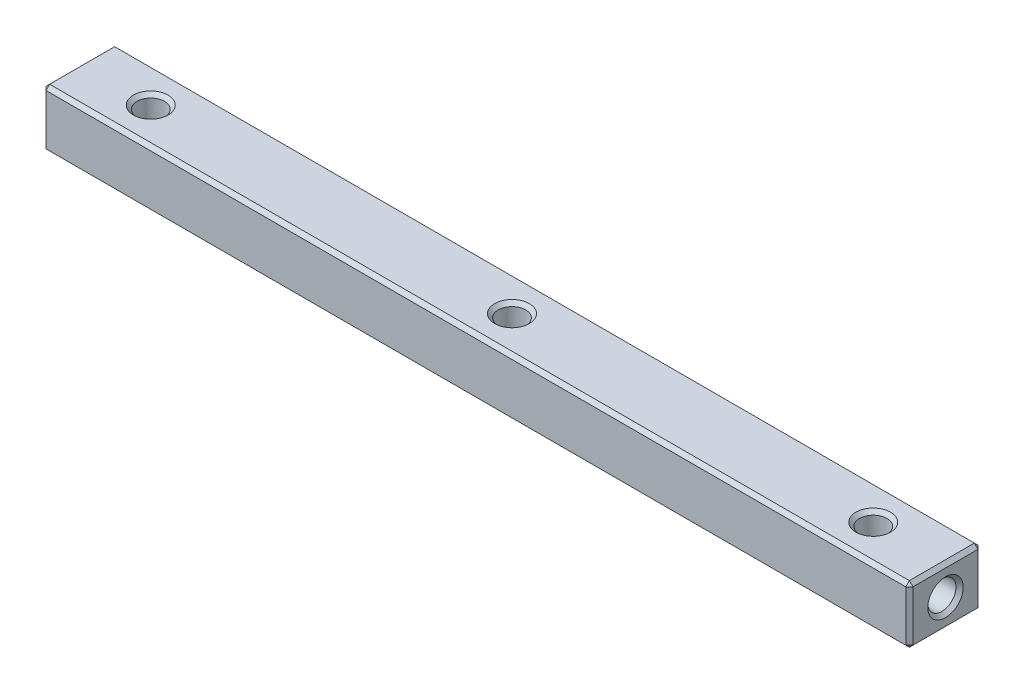
ISO-10303-21;
HEADER;
FILE_DESCRIPTION(('STEP AP214'),'2;1');
FILE_NAME('part.step','',(''),(''),'','','');
FILE_SCHEMA(('AUTOMOTIVE_DESIGN { 1 0 10303 214 1 1 1 1 }'));
ENDSEC;
DATA;
#1=APPLICATION_CONTEXT('core data for automotive mechanical design processes');
#2=APPLICATION_PROTOCOL_DEFINITION('international standard','automotive_design',2000,#1);
#3=PRODUCT_CONTEXT('',#1,'mechanical');
#4=PRODUCT('Part','Part','',(#3));
#5=PRODUCT_RELATED_PRODUCT_CATEGORY('part','',(#4));
#6=PRODUCT_DEFINITION_FORMATION('','',#4);
#7=PRODUCT_DEFINITION_CONTEXT('part definition',#1,'design');
#8=PRODUCT_DEFINITION('design','',#6,#7);
#9=PRODUCT_DEFINITION_SHAPE('','',#8);
#10=(LENGTH_UNIT() NAMED_UNIT(*) SI_UNIT(.MILLI.,.METRE.));
#11=(NAMED_UNIT(*) PLANE_ANGLE_UNIT() SI_UNIT($,.RADIAN.));
#12=(NAMED_UNIT(*) SI_UNIT($,.STERADIAN.) SOLID_ANGLE_UNIT());
#13=UNCERTAINTY_MEASURE_WITH_UNIT(LENGTH_MEASURE(1.E-05),#10,'distance_accuracy_value','');
#14=(GEOMETRIC_REPRESENTATION_CONTEXT(3) GLOBAL_UNCERTAINTY_ASSIGNED_CONTEXT((#13)) GLOBAL_UNIT_ASSIGNED_CONTEXT((#10,
#11,#12)) REPRESENTATION_CONTEXT('',''));
#15=CARTESIAN_POINT('',(0.,0.,0.));
#16=DIRECTION('',(0.,0.,1.));
#17=DIRECTION('',(1.,0.,0.));
#18=AXIS2_PLACEMENT_3D('',#15,#16,#17);
#19=CARTESIAN_POINT('',(0.,4.,0.));
#20=DIRECTION('',(0.,1.,0.));
#21=DIRECTION('',(0.,0.,1.));
#22=AXIS2_PLACEMENT_3D('',#19,#20,#21);
#23=PLANE('',#22);
#24=CARTESIAN_POINT('',(0.,4.,0.));
#25=DIRECTION('',(0.,1.,0.));
#26=DIRECTION('',(0.,0.,1.));
#27=AXIS2_PLACEMENT_3D('',#24,#25,#26);
#28=CIRCLE('',#27,2.4);
#29=CARTESIAN_POINT('',(0.,4.,2.4));
#30=VERTEX_POINT('',#29);
#31=EDGE_CURVE('E242',#30,#30,#28,.F.);
#32=ORIENTED_EDGE('',*,*,#31,.T.);
#33=EDGE_LOOP('',(#32));
#34=FACE_BOUND('',#33,.T.);
#35=CARTESIAN_POINT('',(-50.,4.,0.));
#36=DIRECTION('',(0.,1.,0.));
#37=DIRECTION('',(0.,0.,1.));
#38=AXIS2_PLACEMENT_3D('',#35,#36,#37);
#39=CIRCLE('',#38,2.4);
#40=CARTESIAN_POINT('',(-50.,4.,2.4));
#41=VERTEX_POINT('',#40);
#42=EDGE_CURVE('E245',#41,#41,#39,.F.);
#43=ORIENTED_EDGE('',*,*,#42,.T.);
#44=EDGE_LOOP('',(#43));
#45=FACE_BOUND('',#44,.T.);
#46=DIRECTION('',(0.,0.,1.));
#47=VECTOR('',#46,1.);
#48=CARTESIAN_POINT('',(-59.5,4.,5.));
#49=LINE('',#48,#47);
#50=CARTESIAN_POINT('',(-59.5,4.,-4.5));
#51=VERTEX_POINT('',#50);
#52=CARTESIAN_POINT('',(-59.5,4.,4.5));
#53=VERTEX_POINT('',#52);
#54=EDGE_CURVE('E240',#51,#53,#49,.T.);
#55=ORIENTED_EDGE('',*,*,#54,.T.);
#56=DIRECTION('',(1.,0.,0.));
#57=VECTOR('',#56,1.);
#58=CARTESIAN_POINT('',(60.,4.,4.5));
#59=LINE('',#58,#57);
#60=CARTESIAN_POINT('',(59.5,4.,4.5));
#61=VERTEX_POINT('',#60);
#62=EDGE_CURVE('E239',#53,#61,#59,.T.);
#63=ORIENTED_EDGE('',*,*,#62,.T.);
#64=DIRECTION('',(0.,0.,-1.));
#65=VECTOR('',#64,1.);
#66=CARTESIAN_POINT('',(59.5,4.,-5.));
#67=LINE('',#66,#65);
#68=CARTESIAN_POINT('',(59.5,4.,-4.5));
#69=VERTEX_POINT('',#68);
#70=EDGE_CURVE('E233',#61,#69,#67,.T.);
#71=ORIENTED_EDGE('',*,*,#70,.T.);
#72=DIRECTION('',(-1.,0.,0.));
#73=VECTOR('',#72,1.);
#74=CARTESIAN_POINT('',(-60.,4.,-4.5));
#75=LINE('',#74,#73);
#76=EDGE_CURVE('E234',#69,#51,#75,.T.);
#77=ORIENTED_EDGE('',*,*,#76,.T.);
#78=EDGE_LOOP('',(#55,#63,#71,#77));
#79=FACE_BOUND('',#78,.T.);
#80=CARTESIAN_POINT('',(50.,4.,0.));
#81=DIRECTION('',(0.,1.,0.));
#82=DIRECTION('',(0.,0.,1.));
#83=AXIS2_PLACEMENT_3D('',#80,#81,#82);
#84=CIRCLE('',#83,2.4);
#85=CARTESIAN_POINT('',(50.,4.,2.4));
#86=VERTEX_POINT('',#85);
#87=EDGE_CURVE('E227',#86,#86,#84,.F.);
#88=ORIENTED_EDGE('',*,*,#87,.T.);
#89=EDGE_LOOP('',(#88));
#90=FACE_BOUND('',#89,.T.);
#91=ADVANCED_FACE('F41',(#34,#45,#79,#90),#23,.T.);
#92=CARTESIAN_POINT('',(0.,-4.,0.));
#93=DIRECTION('',(0.,1.,0.));
#94=DIRECTION('',(0.,0.,1.));
#95=AXIS2_PLACEMENT_3D('',#92,#93,#94);
#96=PLANE('',#95);
#97=CARTESIAN_POINT('',(0.,-4.,0.));
#98=DIRECTION('',(0.,1.,0.));
#99=DIRECTION('',(0.,0.,1.));
#100=AXIS2_PLACEMENT_3D('',#97,#98,#99);
#101=CIRCLE('',#100,2.4);
#102=CARTESIAN_POINT('',(0.,-4.,2.4));
#103=VERTEX_POINT('',#102);
#104=EDGE_CURVE('E207',#103,#103,#101,.T.);
#105=ORIENTED_EDGE('',*,*,#104,.T.);
#106=EDGE_LOOP('',(#105));
#107=FACE_BOUND('',#106,.T.);
#108=CARTESIAN_POINT('',(50.,-4.,0.));
#109=DIRECTION('',(0.,1.,0.));
#110=DIRECTION('',(0.,0.,1.));
#111=AXIS2_PLACEMENT_3D('',#108,#109,#110);
#112=CIRCLE('',#111,2.4);
#113=CARTESIAN_POINT('',(50.,-4.,2.4));
#114=VERTEX_POINT('',#113);
#115=EDGE_CURVE('E206',#114,#114,#112,.T.);
#116=ORIENTED_EDGE('',*,*,#115,.T.);
#117=EDGE_LOOP('',(#116));
#118=FACE_BOUND('',#117,.T.);
#119=CARTESIAN_POINT('',(-50.,-4.,0.));
#120=DIRECTION('',(0.,1.,0.));
#121=DIRECTION('',(0.,0.,1.));
#122=AXIS2_PLACEMENT_3D('',#119,#120,#121);
#123=CIRCLE('',#122,2.4);
#124=CARTESIAN_POINT('',(-50.,-4.,2.4));
#125=VERTEX_POINT('',#124);
#126=EDGE_CURVE('E201',#125,#125,#123,.T.);
#127=ORIENTED_EDGE('',*,*,#126,.T.);
#128=EDGE_LOOP('',(#127));
#129=FACE_BOUND('',#128,.T.);
#130=DIRECTION('',(0.,0.,-1.));
#131=VECTOR('',#130,1.);
#132=CARTESIAN_POINT('',(-59.5,-4.,0.));
#133=LINE('',#132,#131);
#134=CARTESIAN_POINT('',(-59.5,-4.,4.49999999999999));
#135=VERTEX_POINT('',#134);
#136=CARTESIAN_POINT('',(-59.5,-4.,-4.49999999999999));
#137=VERTEX_POINT('',#136);
#138=EDGE_CURVE('E196',#135,#137,#133,.T.);
#139=ORIENTED_EDGE('',*,*,#138,.T.);
#140=DIRECTION('',(1.,0.,0.));
#141=VECTOR('',#140,1.);
#142=CARTESIAN_POINT('',(0.,-4.,-4.49999999999999));
#143=LINE('',#142,#141);
#144=CARTESIAN_POINT('',(59.5,-4.,-4.49999999999999));
#145=VERTEX_POINT('',#144);
#146=EDGE_CURVE('E199',#137,#145,#143,.T.);
#147=ORIENTED_EDGE('',*,*,#146,.T.);
#148=DIRECTION('',(0.,0.,1.));
#149=VECTOR('',#148,1.);
#150=CARTESIAN_POINT('',(59.5,-4.,0.));
#151=LINE('',#150,#149);
#152=CARTESIAN_POINT('',(59.5,-4.,4.49999999999999));
#153=VERTEX_POINT('',#152);
#154=EDGE_CURVE('E198',#145,#153,#151,.T.);
#155=ORIENTED_EDGE('',*,*,#154,.T.);
#156=DIRECTION('',(-1.,0.,0.));
#157=VECTOR('',#156,1.);
#158=CARTESIAN_POINT('',(0.,-4.,4.49999999999999));
#159=LINE('',#158,#157);
#160=EDGE_CURVE('E192',#153,#135,#159,.T.);
#161=ORIENTED_EDGE('',*,*,#160,.T.);
#162=EDGE_LOOP('',(#139,#147,#155,#161));
#163=FACE_BOUND('',#162,.T.);
#164=ADVANCED_FACE('F325',(#107,#118,#129,#163),#96,.F.);
#165=CARTESIAN_POINT('',(60.,4.,-5.));
#166=DIRECTION('',(-1.,0.,0.));
#167=DIRECTION('',(0.,0.,1.));
#168=AXIS2_PLACEMENT_3D('',#165,#166,#167);
#169=PLANE('',#168);
#170=CARTESIAN_POINT('',(60.,0.,0.));
#171=DIRECTION('',(-1.,0.,0.));
#172=DIRECTION('',(0.,0.,1.));
#173=AXIS2_PLACEMENT_3D('',#170,#171,#172);
#174=CIRCLE('',#173,2.45000000000002);
#175=CARTESIAN_POINT('',(60.,0.,2.45000000000002));
#176=VERTEX_POINT('',#175);
#177=EDGE_CURVE('E186',#176,#176,#174,.T.);
#178=ORIENTED_EDGE('',*,*,#177,.T.);
#179=EDGE_LOOP('',(#178));
#180=FACE_BOUND('',#179,.T.);
#181=DIRECTION('',(0.,0.,-1.));
#182=VECTOR('',#181,1.);
#183=CARTESIAN_POINT('',(60.,-3.49999999999999,-5.));
#184=LINE('',#183,#182);
#185=CARTESIAN_POINT('',(60.,-3.49999999999999,4.49999999999999));
#186=VERTEX_POINT('',#185);
#187=CARTESIAN_POINT('',(60.,-3.49999999999999,-4.49999999999999));
#188=VERTEX_POINT('',#187);
#189=EDGE_CURVE('E181',#186,#188,#184,.T.);
#190=ORIENTED_EDGE('',*,*,#189,.T.);
#191=DIRECTION('',(0.,1.,0.));
#192=VECTOR('',#191,1.);
#193=CARTESIAN_POINT('',(60.,4.,-4.49999999999999));
#194=LINE('',#193,#192);
#195=CARTESIAN_POINT('',(60.,3.49999999999999,-4.49999999999999));
#196=VERTEX_POINT('',#195);
#197=EDGE_CURVE('E183',#188,#196,#194,.T.);
#198=ORIENTED_EDGE('',*,*,#197,.T.);
#199=DIRECTION('',(0.,0.,1.));
#200=VECTOR('',#199,1.);
#201=CARTESIAN_POINT('',(60.,3.49999999999999,5.));
#202=LINE('',#201,#200);
#203=CARTESIAN_POINT('',(60.,3.49999999999999,4.49999999999999));
#204=VERTEX_POINT('',#203);
#205=EDGE_CURVE('E177',#196,#204,#202,.T.);
#206=ORIENTED_EDGE('',*,*,#205,.T.);
#207=DIRECTION('',(0.,-1.,0.));
#208=VECTOR('',#207,1.);
#209=CARTESIAN_POINT('',(60.,4.,4.49999999999999));
#210=LINE('',#209,#208);
#211=EDGE_CURVE('E182',#204,#186,#210,.T.);
#212=ORIENTED_EDGE('',*,*,#211,.T.);
#213=EDGE_LOOP('',(#190,#198,#206,#212));
#214=FACE_BOUND('',#213,.T.);
#215=ADVANCED_FACE('F350',(#180,#214),#169,.F.);
#216=CARTESIAN_POINT('',(-60.,4.,-5.));
#217=DIRECTION('',(0.,0.,1.));
#218=DIRECTION('',(1.,0.,0.));
#219=AXIS2_PLACEMENT_3D('',#216,#217,#218);
#220=PLANE('',#219);
#221=DIRECTION('',(0.,-1.,0.));
#222=VECTOR('',#221,1.);
#223=CARTESIAN_POINT('',(59.5,4.,-5.));
#224=LINE('',#223,#222);
#225=CARTESIAN_POINT('',(59.5,3.49999999999999,-5.));
#226=VERTEX_POINT('',#225);
#227=CARTESIAN_POINT('',(59.5,-3.5,-5.));
#228=VERTEX_POINT('',#227);
#229=EDGE_CURVE('E252',#226,#228,#224,.T.);
#230=ORIENTED_EDGE('',*,*,#229,.T.);
#231=DIRECTION('',(-1.,0.,0.));
#232=VECTOR('',#231,1.);
#233=CARTESIAN_POINT('',(-60.,-3.5,-5.));
#234=LINE('',#233,#232);
#235=CARTESIAN_POINT('',(-59.5,-3.5,-5.));
#236=VERTEX_POINT('',#235);
#237=EDGE_CURVE('E254',#228,#236,#234,.T.);
#238=ORIENTED_EDGE('',*,*,#237,.T.);
#239=DIRECTION('',(0.,1.,0.));
#240=VECTOR('',#239,1.);
#241=CARTESIAN_POINT('',(-59.5,4.,-5.));
#242=LINE('',#241,#240);
#243=CARTESIAN_POINT('',(-59.5,3.49999999999999,-5.));
#244=VERTEX_POINT('',#243);
#245=EDGE_CURVE('E249',#236,#244,#242,.T.);
#246=ORIENTED_EDGE('',*,*,#245,.T.);
#247=DIRECTION('',(1.,0.,0.));
#248=VECTOR('',#247,1.);
#249=CARTESIAN_POINT('',(60.,3.49999999999999,-5.));
#250=LINE('',#249,#248);
#251=EDGE_CURVE('E248',#244,#226,#250,.T.);
#252=ORIENTED_EDGE('',*,*,#251,.T.);
#253=EDGE_LOOP('',(#230,#238,#246,#252));
#254=FACE_BOUND('',#253,.T.);
#255=ADVANCED_FACE('F359',(#254),#220,.F.);
#256=CARTESIAN_POINT('',(-60.,4.,-5.));
#257=DIRECTION('',(1.,0.,0.));
#258=DIRECTION('',(0.,0.,-1.));
#259=AXIS2_PLACEMENT_3D('',#256,#257,#258);
#260=PLANE('',#259);
#261=CARTESIAN_POINT('',(-60.,0.,0.));
#262=DIRECTION('',(1.,0.,0.));
#263=DIRECTION('',(0.,0.,-1.));
#264=AXIS2_PLACEMENT_3D('',#261,#262,#263);
#265=CIRCLE('',#264,2.45000000000001);
#266=CARTESIAN_POINT('',(-60.,0.,-2.45000000000001));
#267=VERTEX_POINT('',#266);
#268=EDGE_CURVE('E176',#267,#267,#265,.T.);
#269=ORIENTED_EDGE('',*,*,#268,.T.);
#270=EDGE_LOOP('',(#269));
#271=FACE_BOUND('',#270,.T.);
#272=DIRECTION('',(0.,0.,-1.));
#273=VECTOR('',#272,1.);
#274=CARTESIAN_POINT('',(-60.,3.49999999999999,-5.));
#275=LINE('',#274,#273);
#276=CARTESIAN_POINT('',(-60.,3.49999999999999,4.49999999999999));
#277=VERTEX_POINT('',#276);
#278=CARTESIAN_POINT('',(-60.,3.49999999999999,-4.5));
#279=VERTEX_POINT('',#278);
#280=EDGE_CURVE('E132',#277,#279,#275,.T.);
#281=ORIENTED_EDGE('',*,*,#280,.T.);
#282=DIRECTION('',(0.,-1.,0.));
#283=VECTOR('',#282,1.);
#284=CARTESIAN_POINT('',(-60.,4.,-4.5));
#285=LINE('',#284,#283);
#286=CARTESIAN_POINT('',(-60.,-3.5,-4.5));
#287=VERTEX_POINT('',#286);
#288=EDGE_CURVE('E174',#279,#287,#285,.T.);
#289=ORIENTED_EDGE('',*,*,#288,.T.);
#290=DIRECTION('',(0.,0.,1.));
#291=VECTOR('',#290,1.);
#292=CARTESIAN_POINT('',(-60.,-3.5,-5.));
#293=LINE('',#292,#291);
#294=CARTESIAN_POINT('',(-60.,-3.5,4.49999999999999));
#295=VERTEX_POINT('',#294);
#296=EDGE_CURVE('E138',#287,#295,#293,.T.);
#297=ORIENTED_EDGE('',*,*,#296,.T.);
#298=DIRECTION('',(0.,1.,0.));
#299=VECTOR('',#298,1.);
#300=CARTESIAN_POINT('',(-60.,4.,4.49999999999999));
#301=LINE('',#300,#299);
#302=EDGE_CURVE('E128',#295,#277,#301,.T.);
#303=ORIENTED_EDGE('',*,*,#302,.T.);
#304=EDGE_LOOP('',(#281,#289,#297,#303));
#305=FACE_BOUND('',#304,.T.);
#306=ADVANCED_FACE('F135',(#271,#305),#260,.F.);
#307=CARTESIAN_POINT('',(-60.,4.,5.));
#308=DIRECTION('',(0.,0.,-1.));
#309=DIRECTION('',(-1.,0.,0.));
#310=AXIS2_PLACEMENT_3D('',#307,#308,#309);
#311=PLANE('',#310);
#312=DIRECTION('',(-1.,0.,0.));
#313=VECTOR('',#312,1.);
#314=CARTESIAN_POINT('',(-60.,3.49999999999999,5.));
#315=LINE('',#314,#313);
#316=CARTESIAN_POINT('',(59.5,3.49999999999999,5.));
#317=VERTEX_POINT('',#316);
#318=CARTESIAN_POINT('',(-59.5,3.49999999999999,5.));
#319=VERTEX_POINT('',#318);
#320=EDGE_CURVE('E260',#317,#319,#315,.T.);
#321=ORIENTED_EDGE('',*,*,#320,.T.);
#322=DIRECTION('',(0.,-1.,0.));
#323=VECTOR('',#322,1.);
#324=CARTESIAN_POINT('',(-59.5,4.,5.));
#325=LINE('',#324,#323);
#326=CARTESIAN_POINT('',(-59.5,-3.5,5.));
#327=VERTEX_POINT('',#326);
#328=EDGE_CURVE('E11',#319,#327,#325,.T.);
#329=ORIENTED_EDGE('',*,*,#328,.T.);
#330=DIRECTION('',(1.,0.,0.));
#331=VECTOR('',#330,1.);
#332=CARTESIAN_POINT('',(-60.,-3.5,5.));
#333=LINE('',#332,#331);
#334=CARTESIAN_POINT('',(59.5,-3.5,5.));
#335=VERTEX_POINT('',#334);
#336=EDGE_CURVE('E51',#327,#335,#333,.T.);
#337=ORIENTED_EDGE('',*,*,#336,.T.);
#338=DIRECTION('',(0.,1.,0.));
#339=VECTOR('',#338,1.);
#340=CARTESIAN_POINT('',(59.5,4.,5.));
#341=LINE('',#340,#339);
#342=EDGE_CURVE('E259',#335,#317,#341,.T.);
#343=ORIENTED_EDGE('',*,*,#342,.T.);
#344=EDGE_LOOP('',(#321,#329,#337,#343));
#345=FACE_BOUND('',#344,.T.);
#346=ADVANCED_FACE('F352',(#345),#311,.F.);
#347=CARTESIAN_POINT('',(-50.,4.,0.));
#348=DIRECTION('',(0.,-1.,0.));
#349=DIRECTION('',(0.,0.,-1.));
#350=AXIS2_PLACEMENT_3D('',#347,#348,#349);
#351=CYLINDRICAL_SURFACE('',#350,1.9);
#352=CARTESIAN_POINT('',(-50.,-3.50000000000001,0.));
#353=DIRECTION('',(0.,1.,0.));
#354=DIRECTION('',(0.,0.,1.));
#355=AXIS2_PLACEMENT_3D('',#352,#353,#354);
#356=CIRCLE('',#355,1.9);
#357=CARTESIAN_POINT('',(-50.,-3.50000000000001,1.9));
#358=VERTEX_POINT('',#357);
#359=EDGE_CURVE('E230',#358,#358,#356,.F.);
#360=ORIENTED_EDGE('',*,*,#359,.T.);
#361=EDGE_LOOP('',(#360));
#362=FACE_BOUND('',#361,.T.);
#363=CARTESIAN_POINT('',(-50.,3.50000000000001,0.));
#364=DIRECTION('',(0.,1.,0.));
#365=DIRECTION('',(0.,0.,1.));
#366=AXIS2_PLACEMENT_3D('',#363,#364,#365);
#367=CIRCLE('',#366,1.9);
#368=CARTESIAN_POINT('',(-50.,3.50000000000001,1.9));
#369=VERTEX_POINT('',#368);
#370=EDGE_CURVE('E221',#369,#369,#367,.T.);
#371=ORIENTED_EDGE('',*,*,#370,.T.);
#372=EDGE_LOOP('',(#371));
#373=FACE_BOUND('',#372,.T.);
#374=ADVANCED_FACE('F355',(#362,#373),#351,.F.);
#375=CARTESIAN_POINT('',(50.,4.,0.));
#376=DIRECTION('',(0.,-1.,0.));
#377=DIRECTION('',(0.,0.,-1.));
#378=AXIS2_PLACEMENT_3D('',#375,#376,#377);
#379=CYLINDRICAL_SURFACE('',#378,1.9);
#380=CARTESIAN_POINT('',(50.,-3.50000000000001,0.));
#381=DIRECTION('',(0.,1.,0.));
#382=DIRECTION('',(0.,0.,1.));
#383=AXIS2_PLACEMENT_3D('',#380,#381,#382);
#384=CIRCLE('',#383,1.9);
#385=CARTESIAN_POINT('',(50.,-3.50000000000001,1.9));
#386=VERTEX_POINT('',#385);
#387=EDGE_CURVE('E222',#386,#386,#384,.F.);
#388=ORIENTED_EDGE('',*,*,#387,.T.);
#389=EDGE_LOOP('',(#388));
#390=FACE_BOUND('',#389,.T.);
#391=CARTESIAN_POINT('',(50.,3.50000000000001,0.));
#392=DIRECTION('',(0.,1.,0.));
#393=DIRECTION('',(0.,0.,1.));
#394=AXIS2_PLACEMENT_3D('',#391,#392,#393);
#395=CIRCLE('',#394,1.9);
#396=CARTESIAN_POINT('',(50.,3.50000000000001,1.9));
#397=VERTEX_POINT('',#396);
#398=EDGE_CURVE('E217',#397,#397,#395,.T.);
#399=ORIENTED_EDGE('',*,*,#398,.T.);
#400=EDGE_LOOP('',(#399));
#401=FACE_BOUND('',#400,.T.);
#402=ADVANCED_FACE('F669',(#390,#401),#379,.F.);
#403=CARTESIAN_POINT('',(0.,4.,0.));
#404=DIRECTION('',(0.,-1.,0.));
#405=DIRECTION('',(0.,0.,-1.));
#406=AXIS2_PLACEMENT_3D('',#403,#404,#405);
#407=CYLINDRICAL_SURFACE('',#406,1.9);
#408=CARTESIAN_POINT('',(0.,-3.50000000000001,0.));
#409=DIRECTION('',(0.,1.,0.));
#410=DIRECTION('',(0.,0.,1.));
#411=AXIS2_PLACEMENT_3D('',#408,#409,#410);
#412=CIRCLE('',#411,1.9);
#413=CARTESIAN_POINT('',(0.,-3.50000000000001,1.9));
#414=VERTEX_POINT('',#413);
#415=EDGE_CURVE('E214',#414,#414,#412,.F.);
#416=ORIENTED_EDGE('',*,*,#415,.T.);
#417=EDGE_LOOP('',(#416));
#418=FACE_BOUND('',#417,.T.);
#419=CARTESIAN_POINT('',(0.,3.50000000000001,0.));
#420=DIRECTION('',(0.,1.,0.));
#421=DIRECTION('',(0.,0.,1.));
#422=AXIS2_PLACEMENT_3D('',#419,#420,#421);
#423=CIRCLE('',#422,1.9);
#424=CARTESIAN_POINT('',(0.,3.50000000000001,1.9));
#425=VERTEX_POINT('',#424);
#426=EDGE_CURVE('E215',#425,#425,#423,.T.);
#427=ORIENTED_EDGE('',*,*,#426,.T.);
#428=EDGE_LOOP('',(#427));
#429=FACE_BOUND('',#428,.T.);
#430=ADVANCED_FACE('F671',(#418,#429),#407,.F.);
#431=CARTESIAN_POINT('',(-52.,0.,0.));
#432=DIRECTION('',(-1.,0.,0.));
#433=DIRECTION('',(0.,0.,1.));
#434=AXIS2_PLACEMENT_3D('',#431,#432,#433);
#435=CYLINDRICAL_SURFACE('',#434,1.95);
#436=CARTESIAN_POINT('',(-59.5,0.,0.));
#437=DIRECTION('',(1.,0.,0.));
#438=DIRECTION('',(0.,0.,-1.));
#439=AXIS2_PLACEMENT_3D('',#436,#437,#438);
#440=CIRCLE('',#439,1.95);
#441=CARTESIAN_POINT('',(-59.5,0.,-1.95));
#442=VERTEX_POINT('',#441);
#443=EDGE_CURVE('E167',#442,#442,#440,.F.);
#444=ORIENTED_EDGE('',*,*,#443,.T.);
#445=EDGE_LOOP('',(#444));
#446=FACE_BOUND('',#445,.T.);
#447=CARTESIAN_POINT('',(-52.,0.,0.));
#448=DIRECTION('',(-1.,0.,0.));
#449=DIRECTION('',(0.,0.,1.));
#450=AXIS2_PLACEMENT_3D('',#447,#448,#449);
#451=CIRCLE('',#450,1.95);
#452=CARTESIAN_POINT('',(-52.,0.,1.95));
#453=VERTEX_POINT('',#452);
#454=EDGE_CURVE('E166',#453,#453,#451,.T.);
#455=ORIENTED_EDGE('',*,*,#454,.F.);
#456=EDGE_LOOP('',(#455));
#457=FACE_BOUND('',#456,.T.);
#458=ADVANCED_FACE('F680',(#446,#457),#435,.F.);
#459=CARTESIAN_POINT('',(-52.,0.,0.));
#460=DIRECTION('',(-1.,0.,0.));
#461=DIRECTION('',(0.,0.,1.));
#462=AXIS2_PLACEMENT_3D('',#459,#460,#461);
#463=PLANE('',#462);
#464=ORIENTED_EDGE('',*,*,#454,.T.);
#465=EDGE_LOOP('',(#464));
#466=FACE_BOUND('',#465,.T.);
#467=ADVANCED_FACE('F684',(#466),#463,.T.);
#468=CARTESIAN_POINT('',(52.,0.,0.));
#469=DIRECTION('',(1.,0.,0.));
#470=DIRECTION('',(0.,0.,-1.));
#471=AXIS2_PLACEMENT_3D('',#468,#469,#470);
#472=CYLINDRICAL_SURFACE('',#471,1.95);
#473=CARTESIAN_POINT('',(59.5,0.,0.));
#474=DIRECTION('',(-1.,0.,0.));
#475=DIRECTION('',(0.,0.,1.));
#476=AXIS2_PLACEMENT_3D('',#473,#474,#475);
#477=CIRCLE('',#476,1.95);
#478=CARTESIAN_POINT('',(59.5,0.,1.95));
#479=VERTEX_POINT('',#478);
#480=EDGE_CURVE('E191',#479,#479,#477,.F.);
#481=ORIENTED_EDGE('',*,*,#480,.T.);
#482=EDGE_LOOP('',(#481));
#483=FACE_BOUND('',#482,.T.);
#484=CARTESIAN_POINT('',(52.,0.,0.));
#485=DIRECTION('',(-1.,0.,0.));
#486=DIRECTION('',(0.,0.,1.));
#487=AXIS2_PLACEMENT_3D('',#484,#485,#486);
#488=CIRCLE('',#487,1.95);
#489=CARTESIAN_POINT('',(52.,0.,1.95));
#490=VERTEX_POINT('',#489);
#491=EDGE_CURVE('E147',#490,#490,#488,.T.);
#492=ORIENTED_EDGE('',*,*,#491,.T.);
#493=EDGE_LOOP('',(#492));
#494=FACE_BOUND('',#493,.T.);
#495=ADVANCED_FACE('F688',(#483,#494),#472,.F.);
#496=CARTESIAN_POINT('',(52.,0.,0.));
#497=DIRECTION('',(1.,0.,0.));
#498=DIRECTION('',(0.,0.,1.));
#499=AXIS2_PLACEMENT_3D('',#496,#497,#498);
#500=PLANE('',#499);
#501=ORIENTED_EDGE('',*,*,#491,.F.);
#502=EDGE_LOOP('',(#501));
#503=FACE_BOUND('',#502,.T.);
#504=ADVANCED_FACE('F376',(#503),#500,.T.);
#505=CARTESIAN_POINT('',(-59.5,0.,0.));
#506=DIRECTION('',(-1.,0.,0.));
#507=DIRECTION('',(0.,0.,1.));
#508=AXIS2_PLACEMENT_3D('',#505,#506,#507);
#509=CONICAL_SURFACE('',#508,1.95,0.785398163397455);
#510=ORIENTED_EDGE('',*,*,#268,.F.);
#511=EDGE_LOOP('',(#510));
#512=FACE_BOUND('',#511,.T.);
#513=ORIENTED_EDGE('',*,*,#443,.F.);
#514=EDGE_LOOP('',(#513));
#515=FACE_BOUND('',#514,.T.);
#516=ADVANCED_FACE('F369',(#512,#515),#509,.F.);
#517=CARTESIAN_POINT('',(60.,0.,0.));
#518=DIRECTION('',(1.,0.,0.));
#519=DIRECTION('',(0.,0.,-1.));
#520=AXIS2_PLACEMENT_3D('',#517,#518,#519);
#521=CONICAL_SURFACE('',#520,2.45000000000002,0.785398163397428);
#522=ORIENTED_EDGE('',*,*,#480,.F.);
#523=EDGE_LOOP('',(#522));
#524=FACE_BOUND('',#523,.T.);
#525=ORIENTED_EDGE('',*,*,#177,.F.);
#526=EDGE_LOOP('',(#525));
#527=FACE_BOUND('',#526,.T.);
#528=ADVANCED_FACE('F374',(#524,#527),#521,.F.);
#529=CARTESIAN_POINT('',(0.,-4.,0.));
#530=DIRECTION('',(0.,-1.,0.));
#531=DIRECTION('',(0.,0.,-1.));
#532=AXIS2_PLACEMENT_3D('',#529,#530,#531);
#533=CONICAL_SURFACE('',#532,2.4,0.785398163397455);
#534=ORIENTED_EDGE('',*,*,#415,.F.);
#535=EDGE_LOOP('',(#534));
#536=FACE_BOUND('',#535,.T.);
#537=ORIENTED_EDGE('',*,*,#104,.F.);
#538=EDGE_LOOP('',(#537));
#539=FACE_BOUND('',#538,.T.);
#540=ADVANCED_FACE('F382',(#536,#539),#533,.F.);
#541=CARTESIAN_POINT('',(50.,-4.,0.));
#542=DIRECTION('',(0.,-1.,0.));
#543=DIRECTION('',(0.,0.,-1.));
#544=AXIS2_PLACEMENT_3D('',#541,#542,#543);
#545=CONICAL_SURFACE('',#544,2.4,0.785398163397455);
#546=ORIENTED_EDGE('',*,*,#387,.F.);
#547=EDGE_LOOP('',(#546));
#548=FACE_BOUND('',#547,.T.);
#549=ORIENTED_EDGE('',*,*,#115,.F.);
#550=EDGE_LOOP('',(#549));
#551=FACE_BOUND('',#550,.T.);
#552=ADVANCED_FACE('F388',(#548,#551),#545,.F.);
#553=CARTESIAN_POINT('',(-50.,-4.,0.));
#554=DIRECTION('',(0.,-1.,0.));
#555=DIRECTION('',(0.,0.,-1.));
#556=AXIS2_PLACEMENT_3D('',#553,#554,#555);
#557=CONICAL_SURFACE('',#556,2.4,0.785398163397455);
#558=ORIENTED_EDGE('',*,*,#359,.F.);
#559=EDGE_LOOP('',(#558));
#560=FACE_BOUND('',#559,.T.);
#561=ORIENTED_EDGE('',*,*,#126,.F.);
#562=EDGE_LOOP('',(#561));
#563=FACE_BOUND('',#562,.T.);
#564=ADVANCED_FACE('F400',(#560,#563),#557,.F.);
#565=CARTESIAN_POINT('',(0.,3.50000000000001,0.));
#566=DIRECTION('',(0.,1.,0.));
#567=DIRECTION('',(0.,0.,1.));
#568=AXIS2_PLACEMENT_3D('',#565,#566,#567);
#569=CONICAL_SURFACE('',#568,1.9,0.785398163397456);
#570=ORIENTED_EDGE('',*,*,#31,.F.);
#571=EDGE_LOOP('',(#570));
#572=FACE_BOUND('',#571,.T.);
#573=ORIENTED_EDGE('',*,*,#426,.F.);
#574=EDGE_LOOP('',(#573));
#575=FACE_BOUND('',#574,.T.);
#576=ADVANCED_FACE('F404',(#572,#575),#569,.F.);
#577=CARTESIAN_POINT('',(-50.,3.50000000000001,0.));
#578=DIRECTION('',(0.,1.,0.));
#579=DIRECTION('',(0.,0.,1.));
#580=AXIS2_PLACEMENT_3D('',#577,#578,#579);
#581=CONICAL_SURFACE('',#580,1.9,0.785398163397456);
#582=ORIENTED_EDGE('',*,*,#42,.F.);
#583=EDGE_LOOP('',(#582));
#584=FACE_BOUND('',#583,.T.);
#585=ORIENTED_EDGE('',*,*,#370,.F.);
#586=EDGE_LOOP('',(#585));
#587=FACE_BOUND('',#586,.T.);
#588=ADVANCED_FACE('F411',(#584,#587),#581,.F.);
#589=CARTESIAN_POINT('',(-59.5,4.,5.));
#590=DIRECTION('',(0.707106781186557,0.,-0.707106781186538));
#591=DIRECTION('',(0.,-1.,0.));
#592=AXIS2_PLACEMENT_3D('',#589,#590,#591);
#593=PLANE('',#592);
#594=DIRECTION('',(-0.707106781186538,0.,-0.707106781186557));
#595=VECTOR('',#594,1.);
#596=CARTESIAN_POINT('',(-60.,3.49999999999999,4.49999999999999));
#597=LINE('',#596,#595);
#598=EDGE_CURVE('E46',#277,#319,#597,.F.);
#599=ORIENTED_EDGE('',*,*,#598,.F.);
#600=ORIENTED_EDGE('',*,*,#302,.F.);
#601=DIRECTION('',(0.707106781186538,0.,0.707106781186557));
#602=VECTOR('',#601,1.);
#603=CARTESIAN_POINT('',(-60.,-3.5,4.49999999999999));
#604=LINE('',#603,#602);
#605=EDGE_CURVE('E151',#327,#295,#604,.F.);
#606=ORIENTED_EDGE('',*,*,#605,.F.);
#607=ORIENTED_EDGE('',*,*,#328,.F.);
#608=EDGE_LOOP('',(#599,#600,#606,#607));
#609=FACE_BOUND('',#608,.T.);
#610=ADVANCED_FACE('F148',(#609),#593,.F.);
#611=CARTESIAN_POINT('',(-60.,3.49999999999999,4.49999999999999));
#612=DIRECTION('',(-0.577350269189642,0.57735026918961,0.577350269189626));
#613=DIRECTION('',(0.707106781186538,0.,0.707106781186557));
#614=AXIS2_PLACEMENT_3D('',#611,#612,#613);
#615=PLANE('',#614);
#616=DIRECTION('',(-0.707106781186538,-0.707106781186557,0.));
#617=VECTOR('',#616,1.);
#618=CARTESIAN_POINT('',(-60.,3.49999999999999,4.49999999999999));
#619=LINE('',#618,#617);
#620=EDGE_CURVE('E153',#277,#53,#619,.F.);
#621=ORIENTED_EDGE('',*,*,#620,.F.);
#622=ORIENTED_EDGE('',*,*,#598,.T.);
#623=DIRECTION('',(0.,0.707106781186557,-0.707106781186538));
#624=VECTOR('',#623,1.);
#625=CARTESIAN_POINT('',(-59.5,3.74999999999999,4.75));
#626=LINE('',#625,#624);
#627=EDGE_CURVE('E154',#53,#319,#626,.F.);
#628=ORIENTED_EDGE('',*,*,#627,.F.);
#629=EDGE_LOOP('',(#621,#622,#628));
#630=FACE_BOUND('',#629,.T.);
#631=ADVANCED_FACE('F152',(#630),#615,.T.);
#632=CARTESIAN_POINT('',(-60.,-3.5,4.49999999999999));
#633=DIRECTION('',(-0.577350269189626,-0.577350269189642,0.57735026918961));
#634=DIRECTION('',(0.707106781186557,-0.707106781186538,0.));
#635=AXIS2_PLACEMENT_3D('',#632,#633,#634);
#636=PLANE('',#635);
#637=DIRECTION('',(0.,-0.707106781186538,-0.707106781186557));
#638=VECTOR('',#637,1.);
#639=CARTESIAN_POINT('',(-59.5,-3.75,4.74999999999999));
#640=LINE('',#639,#638);
#641=EDGE_CURVE('E310',#327,#135,#640,.T.);
#642=ORIENTED_EDGE('',*,*,#641,.F.);
#643=ORIENTED_EDGE('',*,*,#605,.T.);
#644=DIRECTION('',(-0.707106781186557,0.707106781186538,0.));
#645=VECTOR('',#644,1.);
#646=CARTESIAN_POINT('',(-60.,-3.5,4.49999999999999));
#647=LINE('',#646,#645);
#648=EDGE_CURVE('E157',#135,#295,#647,.T.);
#649=ORIENTED_EDGE('',*,*,#648,.F.);
#650=EDGE_LOOP('',(#642,#643,#649));
#651=FACE_BOUND('',#650,.T.);
#652=ADVANCED_FACE('F312',(#651),#636,.T.);
#653=CARTESIAN_POINT('',(0.,4.,4.5));
#654=DIRECTION('',(0.,0.707106781186538,0.707106781186557));
#655=DIRECTION('',(-1.,0.,0.));
#656=AXIS2_PLACEMENT_3D('',#653,#654,#655);
#657=PLANE('',#656);
#658=ORIENTED_EDGE('',*,*,#627,.T.);
#659=ORIENTED_EDGE('',*,*,#320,.F.);
#660=DIRECTION('',(0.,-0.707106781186557,0.707106781186538));
#661=VECTOR('',#660,1.);
#662=CARTESIAN_POINT('',(59.5,3.49999999999999,5.));
#663=LINE('',#662,#661);
#664=EDGE_CURVE('E303',#61,#317,#663,.T.);
#665=ORIENTED_EDGE('',*,*,#664,.F.);
#666=ORIENTED_EDGE('',*,*,#62,.F.);
#667=EDGE_LOOP('',(#658,#659,#665,#666));
#668=FACE_BOUND('',#667,.T.);
#669=ADVANCED_FACE('F513',(#668),#657,.T.);
#670=CARTESIAN_POINT('',(-59.5,4.,0.));
#671=DIRECTION('',(-0.707106781186557,0.707106781186538,0.));
#672=DIRECTION('',(0.,0.,-1.));
#673=AXIS2_PLACEMENT_3D('',#670,#671,#672);
#674=PLANE('',#673);
#675=ORIENTED_EDGE('',*,*,#620,.T.);
#676=ORIENTED_EDGE('',*,*,#54,.F.);
#677=DIRECTION('',(0.707106781186538,0.707106781186557,0.));
#678=VECTOR('',#677,1.);
#679=CARTESIAN_POINT('',(-59.75,3.74999999999999,-4.5));
#680=LINE('',#679,#678);
#681=EDGE_CURVE('E163',#279,#51,#680,.T.);
#682=ORIENTED_EDGE('',*,*,#681,.F.);
#683=ORIENTED_EDGE('',*,*,#280,.F.);
#684=EDGE_LOOP('',(#675,#676,#682,#683));
#685=FACE_BOUND('',#684,.T.);
#686=ADVANCED_FACE('F165',(#685),#674,.T.);
#687=CARTESIAN_POINT('',(-60.,4.,-4.5));
#688=DIRECTION('',(0.707106781186538,0.,0.707106781186557));
#689=DIRECTION('',(0.,-1.,0.));
#690=AXIS2_PLACEMENT_3D('',#687,#688,#689);
#691=PLANE('',#690);
#692=DIRECTION('',(-0.707106781186557,0.,0.707106781186538));
#693=VECTOR('',#692,1.);
#694=CARTESIAN_POINT('',(-60.,-3.5,-4.5));
#695=LINE('',#694,#693);
#696=EDGE_CURVE('E300',#287,#236,#695,.F.);
#697=ORIENTED_EDGE('',*,*,#696,.F.);
#698=ORIENTED_EDGE('',*,*,#288,.F.);
#699=DIRECTION('',(0.707106781186557,0.,-0.707106781186538));
#700=VECTOR('',#699,1.);
#701=CARTESIAN_POINT('',(-59.5,3.49999999999999,-5.));
#702=LINE('',#701,#700);
#703=EDGE_CURVE('E297',#244,#279,#702,.F.);
#704=ORIENTED_EDGE('',*,*,#703,.F.);
#705=ORIENTED_EDGE('',*,*,#245,.F.);
#706=EDGE_LOOP('',(#697,#698,#704,#705));
#707=FACE_BOUND('',#706,.T.);
#708=ADVANCED_FACE('F340',(#707),#691,.F.);
#709=CARTESIAN_POINT('',(-60.,-3.5,-5.));
#710=DIRECTION('',(0.707106781186538,0.707106781186557,0.));
#711=DIRECTION('',(0.,0.,1.));
#712=AXIS2_PLACEMENT_3D('',#709,#710,#711);
#713=PLANE('',#712);
#714=ORIENTED_EDGE('',*,*,#648,.T.);
#715=ORIENTED_EDGE('',*,*,#296,.F.);
#716=DIRECTION('',(0.707106781186557,-0.707106781186538,0.));
#717=VECTOR('',#716,1.);
#718=CARTESIAN_POINT('',(-60.,-3.5,-4.5));
#719=LINE('',#718,#717);
#720=EDGE_CURVE('E293',#137,#287,#719,.F.);
#721=ORIENTED_EDGE('',*,*,#720,.F.);
#722=ORIENTED_EDGE('',*,*,#138,.F.);
#723=EDGE_LOOP('',(#714,#715,#721,#722));
#724=FACE_BOUND('',#723,.T.);
#725=ADVANCED_FACE('F318',(#724),#713,.F.);
#726=CARTESIAN_POINT('',(-60.,-3.5,5.));
#727=DIRECTION('',(0.,0.707106781186557,-0.707106781186538));
#728=DIRECTION('',(1.,0.,0.));
#729=AXIS2_PLACEMENT_3D('',#726,#727,#728);
#730=PLANE('',#729);
#731=ORIENTED_EDGE('',*,*,#641,.T.);
#732=ORIENTED_EDGE('',*,*,#160,.F.);
#733=DIRECTION('',(0.,0.707106781186538,0.707106781186557));
#734=VECTOR('',#733,1.);
#735=CARTESIAN_POINT('',(59.5,-4.,4.49999999999999));
#736=LINE('',#735,#734);
#737=EDGE_CURVE('E295',#335,#153,#736,.F.);
#738=ORIENTED_EDGE('',*,*,#737,.F.);
#739=ORIENTED_EDGE('',*,*,#336,.F.);
#740=EDGE_LOOP('',(#731,#732,#738,#739));
#741=FACE_BOUND('',#740,.T.);
#742=ADVANCED_FACE('F326',(#741),#730,.F.);
#743=CARTESIAN_POINT('',(60.,4.,4.49999999999999));
#744=DIRECTION('',(-0.707106781186557,0.,-0.707106781186538));
#745=DIRECTION('',(0.,-1.,0.));
#746=AXIS2_PLACEMENT_3D('',#743,#744,#745);
#747=PLANE('',#746);
#748=DIRECTION('',(-0.707106781186538,0.,0.707106781186557));
#749=VECTOR('',#748,1.);
#750=CARTESIAN_POINT('',(59.5,3.49999999999999,5.));
#751=LINE('',#750,#749);
#752=EDGE_CURVE('E308',#317,#204,#751,.F.);
#753=ORIENTED_EDGE('',*,*,#752,.F.);
#754=ORIENTED_EDGE('',*,*,#342,.F.);
#755=DIRECTION('',(0.707106781186538,0.,-0.707106781186557));
#756=VECTOR('',#755,1.);
#757=CARTESIAN_POINT('',(59.75,-3.49999999999999,4.74999999999999));
#758=LINE('',#757,#756);
#759=EDGE_CURVE('E287',#186,#335,#758,.F.);
#760=ORIENTED_EDGE('',*,*,#759,.F.);
#761=ORIENTED_EDGE('',*,*,#211,.F.);
#762=EDGE_LOOP('',(#753,#754,#760,#761));
#763=FACE_BOUND('',#762,.T.);
#764=ADVANCED_FACE('F327',(#763),#747,.F.);
#765=CARTESIAN_POINT('',(59.5,3.49999999999999,5.));
#766=DIRECTION('',(0.577350269189642,0.57735026918961,0.577350269189626));
#767=DIRECTION('',(0.707106781186538,0.,-0.707106781186557));
#768=AXIS2_PLACEMENT_3D('',#765,#766,#767);
#769=PLANE('',#768);
#770=ORIENTED_EDGE('',*,*,#664,.T.);
#771=ORIENTED_EDGE('',*,*,#752,.T.);
#772=DIRECTION('',(-0.707106781186538,0.707106781186557,0.));
#773=VECTOR('',#772,1.);
#774=CARTESIAN_POINT('',(59.75,3.74999999999999,4.49999999999999));
#775=LINE('',#774,#773);
#776=EDGE_CURVE('E286',#61,#204,#775,.F.);
#777=ORIENTED_EDGE('',*,*,#776,.F.);
#778=EDGE_LOOP('',(#770,#771,#777));
#779=FACE_BOUND('',#778,.T.);
#780=ADVANCED_FACE('F331',(#779),#769,.T.);
#781=CARTESIAN_POINT('',(-59.5,3.49999999999999,-5.));
#782=DIRECTION('',(-0.577350269189626,0.57735026918961,-0.577350269189642));
#783=DIRECTION('',(-0.707106781186557,0.,0.707106781186538));
#784=AXIS2_PLACEMENT_3D('',#781,#782,#783);
#785=PLANE('',#784);
#786=ORIENTED_EDGE('',*,*,#703,.T.);
#787=ORIENTED_EDGE('',*,*,#681,.T.);
#788=DIRECTION('',(0.,-0.707106781186557,-0.707106781186538));
#789=VECTOR('',#788,1.);
#790=CARTESIAN_POINT('',(-59.5,3.49999999999999,-5.));
#791=LINE('',#790,#789);
#792=EDGE_CURVE('E281',#244,#51,#791,.F.);
#793=ORIENTED_EDGE('',*,*,#792,.F.);
#794=EDGE_LOOP('',(#786,#787,#793));
#795=FACE_BOUND('',#794,.T.);
#796=ADVANCED_FACE('F485',(#795),#785,.T.);
#797=CARTESIAN_POINT('',(-60.,-3.5,-4.5));
#798=DIRECTION('',(-0.57735026918961,-0.577350269189642,-0.577350269189626));
#799=DIRECTION('',(0.,0.707106781186538,-0.707106781186557));
#800=AXIS2_PLACEMENT_3D('',#797,#798,#799);
#801=PLANE('',#800);
#802=ORIENTED_EDGE('',*,*,#720,.T.);
#803=ORIENTED_EDGE('',*,*,#696,.T.);
#804=DIRECTION('',(0.,0.707106781186538,-0.707106781186557));
#805=VECTOR('',#804,1.);
#806=CARTESIAN_POINT('',(-59.5,-3.75,-4.74999999999999));
#807=LINE('',#806,#805);
#808=EDGE_CURVE('E278',#137,#236,#807,.T.);
#809=ORIENTED_EDGE('',*,*,#808,.F.);
#810=EDGE_LOOP('',(#802,#803,#809));
#811=FACE_BOUND('',#810,.T.);
#812=ADVANCED_FACE('F474',(#811),#801,.T.);
#813=CARTESIAN_POINT('',(59.5,-4.,4.49999999999999));
#814=DIRECTION('',(0.577350269189642,-0.577350269189626,0.57735026918961));
#815=DIRECTION('',(0.707106781186538,0.707106781186557,0.));
#816=AXIS2_PLACEMENT_3D('',#813,#814,#815);
#817=PLANE('',#816);
#818=ORIENTED_EDGE('',*,*,#759,.T.);
#819=ORIENTED_EDGE('',*,*,#737,.T.);
#820=DIRECTION('',(-0.707106781186538,-0.707106781186557,0.));
#821=VECTOR('',#820,1.);
#822=CARTESIAN_POINT('',(59.5,-4.,4.49999999999999));
#823=LINE('',#822,#821);
#824=EDGE_CURVE('E280',#186,#153,#823,.T.);
#825=ORIENTED_EDGE('',*,*,#824,.F.);
#826=EDGE_LOOP('',(#818,#819,#825));
#827=FACE_BOUND('',#826,.T.);
#828=ADVANCED_FACE('F468',(#827),#817,.T.);
#829=CARTESIAN_POINT('',(59.5,4.,0.));
#830=DIRECTION('',(0.707106781186557,0.707106781186538,0.));
#831=DIRECTION('',(0.,0.,1.));
#832=AXIS2_PLACEMENT_3D('',#829,#830,#831);
#833=PLANE('',#832);
#834=ORIENTED_EDGE('',*,*,#776,.T.);
#835=ORIENTED_EDGE('',*,*,#205,.F.);
#836=DIRECTION('',(0.707106781186538,-0.707106781186557,0.));
#837=VECTOR('',#836,1.);
#838=CARTESIAN_POINT('',(60.,3.49999999999999,-4.49999999999999));
#839=LINE('',#838,#837);
#840=EDGE_CURVE('E273',#69,#196,#839,.T.);
#841=ORIENTED_EDGE('',*,*,#840,.F.);
#842=ORIENTED_EDGE('',*,*,#70,.F.);
#843=EDGE_LOOP('',(#834,#835,#841,#842));
#844=FACE_BOUND('',#843,.T.);
#845=ADVANCED_FACE('F463',(#844),#833,.T.);
#846=CARTESIAN_POINT('',(0.,4.,-4.5));
#847=DIRECTION('',(0.,0.707106781186538,-0.707106781186557));
#848=DIRECTION('',(1.,0.,0.));
#849=AXIS2_PLACEMENT_3D('',#846,#847,#848);
#850=PLANE('',#849);
#851=ORIENTED_EDGE('',*,*,#792,.T.);
#852=ORIENTED_EDGE('',*,*,#76,.F.);
#853=DIRECTION('',(0.,0.707106781186557,0.707106781186538));
#854=VECTOR('',#853,1.);
#855=CARTESIAN_POINT('',(59.5,3.74999999999999,-4.75));
#856=LINE('',#855,#854);
#857=EDGE_CURVE('E271',#226,#69,#856,.T.);
#858=ORIENTED_EDGE('',*,*,#857,.F.);
#859=ORIENTED_EDGE('',*,*,#251,.F.);
#860=EDGE_LOOP('',(#851,#852,#858,#859));
#861=FACE_BOUND('',#860,.T.);
#862=ADVANCED_FACE('F452',(#861),#850,.T.);
#863=CARTESIAN_POINT('',(-60.,-3.5,-5.));
#864=DIRECTION('',(0.,0.707106781186557,0.707106781186538));
#865=DIRECTION('',(-1.,0.,0.));
#866=AXIS2_PLACEMENT_3D('',#863,#864,#865);
#867=PLANE('',#866);
#868=ORIENTED_EDGE('',*,*,#808,.T.);
#869=ORIENTED_EDGE('',*,*,#237,.F.);
#870=DIRECTION('',(0.,-0.707106781186538,0.707106781186557));
#871=VECTOR('',#870,1.);
#872=CARTESIAN_POINT('',(59.5,-3.5,-5.));
#873=LINE('',#872,#871);
#874=EDGE_CURVE('E268',#145,#228,#873,.F.);
#875=ORIENTED_EDGE('',*,*,#874,.F.);
#876=ORIENTED_EDGE('',*,*,#146,.F.);
#877=EDGE_LOOP('',(#868,#869,#875,#876));
#878=FACE_BOUND('',#877,.T.);
#879=ADVANCED_FACE('F450',(#878),#867,.F.);
#880=CARTESIAN_POINT('',(60.,-3.49999999999999,-5.));
#881=DIRECTION('',(-0.707106781186557,0.707106781186538,0.));
#882=DIRECTION('',(0.,0.,-1.));
#883=AXIS2_PLACEMENT_3D('',#880,#881,#882);
#884=PLANE('',#883);
#885=ORIENTED_EDGE('',*,*,#824,.T.);
#886=ORIENTED_EDGE('',*,*,#154,.F.);
#887=DIRECTION('',(0.707106781186538,0.707106781186557,0.));
#888=VECTOR('',#887,1.);
#889=CARTESIAN_POINT('',(59.75,-3.74999999999999,-4.49999999999999));
#890=LINE('',#889,#888);
#891=EDGE_CURVE('E266',#188,#145,#890,.F.);
#892=ORIENTED_EDGE('',*,*,#891,.F.);
#893=ORIENTED_EDGE('',*,*,#189,.F.);
#894=EDGE_LOOP('',(#885,#886,#892,#893));
#895=FACE_BOUND('',#894,.T.);
#896=ADVANCED_FACE('F439',(#895),#884,.F.);
#897=CARTESIAN_POINT('',(60.,3.49999999999999,-4.49999999999999));
#898=DIRECTION('',(0.577350269189642,0.57735026918961,-0.577350269189626));
#899=DIRECTION('',(-0.707106781186538,0.,-0.707106781186557));
#900=AXIS2_PLACEMENT_3D('',#897,#898,#899);
#901=PLANE('',#900);
#902=ORIENTED_EDGE('',*,*,#857,.T.);
#903=ORIENTED_EDGE('',*,*,#840,.T.);
#904=DIRECTION('',(0.707106781186538,0.,0.707106781186557));
#905=VECTOR('',#904,1.);
#906=CARTESIAN_POINT('',(60.,3.49999999999999,-4.49999999999999));
#907=LINE('',#906,#905);
#908=EDGE_CURVE('E262',#226,#196,#907,.T.);
#909=ORIENTED_EDGE('',*,*,#908,.F.);
#910=EDGE_LOOP('',(#902,#903,#909));
#911=FACE_BOUND('',#910,.T.);
#912=ADVANCED_FACE('F433',(#911),#901,.T.);
#913=CARTESIAN_POINT('',(59.5,-3.5,-5.));
#914=DIRECTION('',(0.577350269189642,-0.577350269189626,-0.57735026918961));
#915=DIRECTION('',(0.707106781186538,0.707106781186557,0.));
#916=AXIS2_PLACEMENT_3D('',#913,#914,#915);
#917=PLANE('',#916);
#918=ORIENTED_EDGE('',*,*,#891,.T.);
#919=ORIENTED_EDGE('',*,*,#874,.T.);
#920=DIRECTION('',(-0.707106781186538,0.,-0.707106781186557));
#921=VECTOR('',#920,1.);
#922=CARTESIAN_POINT('',(59.5,-3.5,-5.));
#923=LINE('',#922,#921);
#924=EDGE_CURVE('E265',#188,#228,#923,.T.);
#925=ORIENTED_EDGE('',*,*,#924,.F.);
#926=EDGE_LOOP('',(#918,#919,#925));
#927=FACE_BOUND('',#926,.T.);
#928=ADVANCED_FACE('F426',(#927),#917,.T.);
#929=CARTESIAN_POINT('',(59.5,4.,-5.));
#930=DIRECTION('',(-0.707106781186557,0.,0.707106781186538));
#931=DIRECTION('',(0.,-1.,0.));
#932=AXIS2_PLACEMENT_3D('',#929,#930,#931);
#933=PLANE('',#932);
#934=ORIENTED_EDGE('',*,*,#908,.T.);
#935=ORIENTED_EDGE('',*,*,#197,.F.);
#936=ORIENTED_EDGE('',*,*,#924,.T.);
#937=ORIENTED_EDGE('',*,*,#229,.F.);
#938=EDGE_LOOP('',(#934,#935,#936,#937));
#939=FACE_BOUND('',#938,.T.);
#940=ADVANCED_FACE('F419',(#939),#933,.F.);
#941=CARTESIAN_POINT('',(50.,3.50000000000001,0.));
#942=DIRECTION('',(0.,1.,0.));
#943=DIRECTION('',(0.,0.,1.));
#944=AXIS2_PLACEMENT_3D('',#941,#942,#943);
#945=CONICAL_SURFACE('',#944,1.9,0.785398163397456);
#946=ORIENTED_EDGE('',*,*,#87,.F.);
#947=EDGE_LOOP('',(#946));
#948=FACE_BOUND('',#947,.T.);
#949=ORIENTED_EDGE('',*,*,#398,.F.);
#950=EDGE_LOOP('',(#949));
#951=FACE_BOUND('',#950,.T.);
#952=ADVANCED_FACE('F42',(#948,#951),#945,.F.);
#953=CLOSED_SHELL('',(#91,#164,#215,#255,#306,#346,#374,#402,#430,#458,#467,#495,#504,#516,#528,
#540,#552,#564,#576,#588,#610,#631,#652,#669,#686,#708,#725,#742,#764,#780,#796,#812,#828,#845,
#862,#879,#896,#912,#928,#940,#952));
#954=MANIFOLD_SOLID_BREP('B2',#953);
#955=ADVANCED_BREP_SHAPE_REPRESENTATION('',(#18,#954),#14);
#956=SHAPE_DEFINITION_REPRESENTATION(#9,#955);
ENDSEC;
END-ISO-10303-21;
